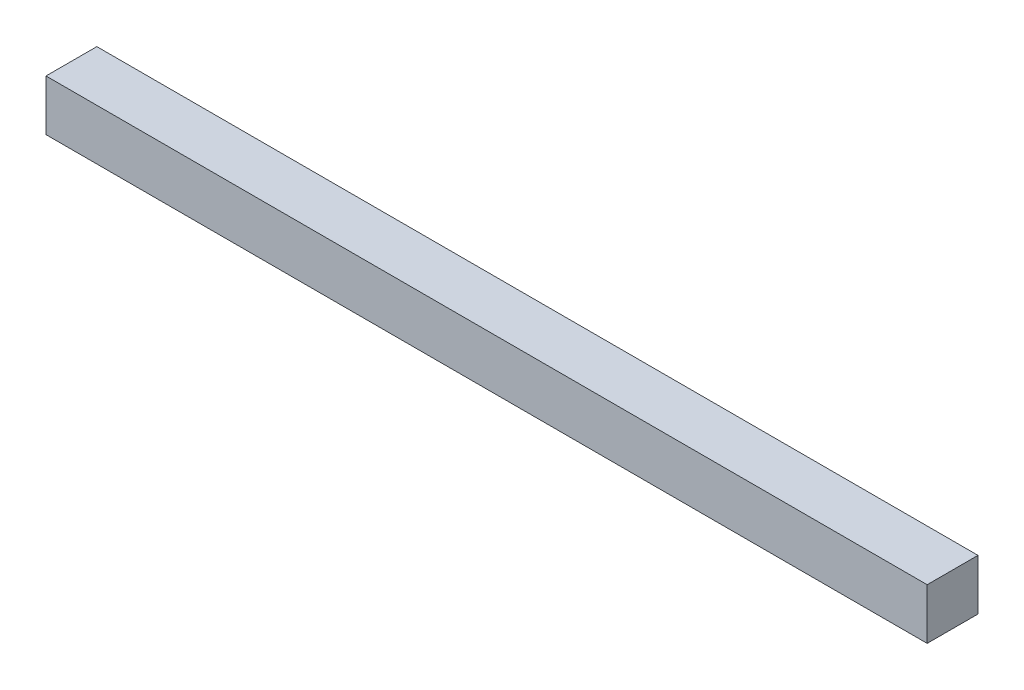
ISO-10303-21;
HEADER;
FILE_DESCRIPTION(('STEP AP214'),'2;1');
FILE_NAME('part.step','',(''),(''),'','','');
FILE_SCHEMA(('AUTOMOTIVE_DESIGN { 1 0 10303 214 1 1 1 1 }'));
ENDSEC;
DATA;
#1=APPLICATION_CONTEXT('core data for automotive mechanical design processes');
#2=APPLICATION_PROTOCOL_DEFINITION('international standard','automotive_design',2000,#1);
#3=PRODUCT_CONTEXT('',#1,'mechanical');
#4=PRODUCT('Part','Part','',(#3));
#5=PRODUCT_RELATED_PRODUCT_CATEGORY('part','',(#4));
#6=PRODUCT_DEFINITION_FORMATION('','',#4);
#7=PRODUCT_DEFINITION_CONTEXT('part definition',#1,'design');
#8=PRODUCT_DEFINITION('design','',#6,#7);
#9=PRODUCT_DEFINITION_SHAPE('','',#8);
#10=(LENGTH_UNIT() NAMED_UNIT(*) SI_UNIT(.MILLI.,.METRE.));
#11=(NAMED_UNIT(*) PLANE_ANGLE_UNIT() SI_UNIT($,.RADIAN.));
#12=(NAMED_UNIT(*) SI_UNIT($,.STERADIAN.) SOLID_ANGLE_UNIT());
#13=UNCERTAINTY_MEASURE_WITH_UNIT(LENGTH_MEASURE(1.E-05),#10,'distance_accuracy_value','');
#14=(GEOMETRIC_REPRESENTATION_CONTEXT(3) GLOBAL_UNCERTAINTY_ASSIGNED_CONTEXT((#13)) GLOBAL_UNIT_ASSIGNED_CONTEXT((#10,
#11,#12)) REPRESENTATION_CONTEXT('',''));
#15=CARTESIAN_POINT('',(0.,0.,0.));
#16=DIRECTION('',(0.,0.,1.));
#17=DIRECTION('',(1.,0.,0.));
#18=AXIS2_PLACEMENT_3D('',#15,#16,#17);
#19=CARTESIAN_POINT('',(-0.0717272727272727,0.00654545454545454,-15.));
#20=DIRECTION('',(0.,-1.,0.));
#21=DIRECTION('',(0.,0.,-1.));
#22=AXIS2_PLACEMENT_3D('',#19,#20,#21);
#23=PLANE('',#22);
#24=DIRECTION('',(1.,0.,0.));
#25=VECTOR('',#24,1.);
#26=CARTESIAN_POINT('',(-0.0717272727272727,0.00654545454545454,0.));
#27=LINE('',#26,#25);
#28=CARTESIAN_POINT('',(-0.0717272727272727,0.00654545454545454,0.));
#29=VERTEX_POINT('',#28);
#30=CARTESIAN_POINT('',(259.928272727273,0.00654545454545454,0.));
#31=VERTEX_POINT('',#30);
#32=EDGE_CURVE('E109',#29,#31,#27,.T.);
#33=ORIENTED_EDGE('',*,*,#32,.F.);
#34=DIRECTION('',(0.,0.,1.));
#35=VECTOR('',#34,1.);
#36=CARTESIAN_POINT('',(-0.0717272727272727,0.00654545454545454,-15.));
#37=LINE('',#36,#35);
#38=CARTESIAN_POINT('',(-0.0717272727272727,0.00654545454545454,-15.));
#39=VERTEX_POINT('',#38);
#40=EDGE_CURVE('E11',#39,#29,#37,.T.);
#41=ORIENTED_EDGE('',*,*,#40,.F.);
#42=DIRECTION('',(1.,0.,0.));
#43=VECTOR('',#42,1.);
#44=CARTESIAN_POINT('',(-0.0717272727272727,0.00654545454545454,-15.));
#45=LINE('',#44,#43);
#46=CARTESIAN_POINT('',(259.928272727273,0.00654545454545454,-15.));
#47=VERTEX_POINT('',#46);
#48=EDGE_CURVE('E101',#39,#47,#45,.T.);
#49=ORIENTED_EDGE('',*,*,#48,.T.);
#50=DIRECTION('',(0.,0.,1.));
#51=VECTOR('',#50,1.);
#52=CARTESIAN_POINT('',(259.928272727273,0.00654545454545454,-15.));
#53=LINE('',#52,#51);
#54=EDGE_CURVE('E42',#47,#31,#53,.T.);
#55=ORIENTED_EDGE('',*,*,#54,.T.);
#56=EDGE_LOOP('',(#33,#41,#49,#55));
#57=FACE_BOUND('',#56,.T.);
#58=ADVANCED_FACE('F39',(#57),#23,.T.);
#59=CARTESIAN_POINT('',(-0.0717272727272746,15.0065454545455,-15.));
#60=DIRECTION('',(-1.,0.,0.));
#61=DIRECTION('',(0.,-1.,0.));
#62=AXIS2_PLACEMENT_3D('',#59,#60,#61);
#63=PLANE('',#62);
#64=DIRECTION('',(0.,-1.,0.));
#65=VECTOR('',#64,1.);
#66=CARTESIAN_POINT('',(-0.0717272727272746,15.0065454545455,0.));
#67=LINE('',#66,#65);
#68=CARTESIAN_POINT('',(-0.0717272727272746,15.0065454545455,0.));
#69=VERTEX_POINT('',#68);
#70=EDGE_CURVE('E104',#69,#29,#67,.T.);
#71=ORIENTED_EDGE('',*,*,#70,.F.);
#72=DIRECTION('',(0.,0.,1.));
#73=VECTOR('',#72,1.);
#74=CARTESIAN_POINT('',(-0.0717272727272746,15.0065454545455,-15.));
#75=LINE('',#74,#73);
#76=CARTESIAN_POINT('',(-0.0717272727272746,15.0065454545455,-15.));
#77=VERTEX_POINT('',#76);
#78=EDGE_CURVE('E49',#77,#69,#75,.T.);
#79=ORIENTED_EDGE('',*,*,#78,.F.);
#80=DIRECTION('',(0.,-1.,0.));
#81=VECTOR('',#80,1.);
#82=CARTESIAN_POINT('',(-0.0717272727272746,15.0065454545455,-15.));
#83=LINE('',#82,#81);
#84=EDGE_CURVE('E88',#77,#39,#83,.T.);
#85=ORIENTED_EDGE('',*,*,#84,.T.);
#86=ORIENTED_EDGE('',*,*,#40,.T.);
#87=EDGE_LOOP('',(#71,#79,#85,#86));
#88=FACE_BOUND('',#87,.T.);
#89=ADVANCED_FACE('F125',(#88),#63,.T.);
#90=CARTESIAN_POINT('',(-0.0717272727272746,15.0065454545455,-15.));
#91=DIRECTION('',(0.,-1.,0.));
#92=DIRECTION('',(0.,0.,-1.));
#93=AXIS2_PLACEMENT_3D('',#90,#91,#92);
#94=PLANE('',#93);
#95=DIRECTION('',(1.,0.,0.));
#96=VECTOR('',#95,1.);
#97=CARTESIAN_POINT('',(-0.0717272727272746,15.0065454545455,0.));
#98=LINE('',#97,#96);
#99=CARTESIAN_POINT('',(259.928272727273,15.0065454545455,0.));
#100=VERTEX_POINT('',#99);
#101=EDGE_CURVE('E94',#69,#100,#98,.T.);
#102=ORIENTED_EDGE('',*,*,#101,.T.);
#103=DIRECTION('',(0.,0.,1.));
#104=VECTOR('',#103,1.);
#105=CARTESIAN_POINT('',(259.928272727273,15.0065454545455,-15.));
#106=LINE('',#105,#104);
#107=CARTESIAN_POINT('',(259.928272727273,15.0065454545455,-15.));
#108=VERTEX_POINT('',#107);
#109=EDGE_CURVE('E92',#108,#100,#106,.T.);
#110=ORIENTED_EDGE('',*,*,#109,.F.);
#111=DIRECTION('',(1.,0.,0.));
#112=VECTOR('',#111,1.);
#113=CARTESIAN_POINT('',(-0.0717272727272746,15.0065454545455,-15.));
#114=LINE('',#113,#112);
#115=EDGE_CURVE('E85',#77,#108,#114,.T.);
#116=ORIENTED_EDGE('',*,*,#115,.F.);
#117=ORIENTED_EDGE('',*,*,#78,.T.);
#118=EDGE_LOOP('',(#102,#110,#116,#117));
#119=FACE_BOUND('',#118,.T.);
#120=ADVANCED_FACE('F93',(#119),#94,.F.);
#121=CARTESIAN_POINT('',(259.928272727273,15.0065454545455,-15.));
#122=DIRECTION('',(-1.,0.,0.));
#123=DIRECTION('',(0.,0.,1.));
#124=AXIS2_PLACEMENT_3D('',#121,#122,#123);
#125=PLANE('',#124);
#126=DIRECTION('',(0.,-1.,0.));
#127=VECTOR('',#126,1.);
#128=CARTESIAN_POINT('',(259.928272727273,15.0065454545455,0.));
#129=LINE('',#128,#127);
#130=EDGE_CURVE('E113',#100,#31,#129,.T.);
#131=ORIENTED_EDGE('',*,*,#130,.T.);
#132=ORIENTED_EDGE('',*,*,#54,.F.);
#133=DIRECTION('',(0.,-1.,0.));
#134=VECTOR('',#133,1.);
#135=CARTESIAN_POINT('',(259.928272727273,15.0065454545455,-15.));
#136=LINE('',#135,#134);
#137=EDGE_CURVE('E82',#108,#47,#136,.T.);
#138=ORIENTED_EDGE('',*,*,#137,.F.);
#139=ORIENTED_EDGE('',*,*,#109,.T.);
#140=EDGE_LOOP('',(#131,#132,#138,#139));
#141=FACE_BOUND('',#140,.T.);
#142=ADVANCED_FACE('F99',(#141),#125,.F.);
#143=CARTESIAN_POINT('',(0.,0.,-15.));
#144=DIRECTION('',(0.,0.,-1.));
#145=DIRECTION('',(-1.,0.,0.));
#146=AXIS2_PLACEMENT_3D('',#143,#144,#145);
#147=PLANE('',#146);
#148=ORIENTED_EDGE('',*,*,#48,.F.);
#149=ORIENTED_EDGE('',*,*,#84,.F.);
#150=ORIENTED_EDGE('',*,*,#115,.T.);
#151=ORIENTED_EDGE('',*,*,#137,.T.);
#152=EDGE_LOOP('',(#148,#149,#150,#151));
#153=FACE_BOUND('',#152,.T.);
#154=ADVANCED_FACE('F87',(#153),#147,.T.);
#155=CARTESIAN_POINT('',(0.,0.,0.));
#156=DIRECTION('',(0.,0.,-1.));
#157=DIRECTION('',(-1.,0.,0.));
#158=AXIS2_PLACEMENT_3D('',#155,#156,#157);
#159=PLANE('',#158);
#160=ORIENTED_EDGE('',*,*,#32,.T.);
#161=ORIENTED_EDGE('',*,*,#130,.F.);
#162=ORIENTED_EDGE('',*,*,#101,.F.);
#163=ORIENTED_EDGE('',*,*,#70,.T.);
#164=EDGE_LOOP('',(#160,#161,#162,#163));
#165=FACE_BOUND('',#164,.T.);
#166=ADVANCED_FACE('F124',(#165),#159,.F.);
#167=CLOSED_SHELL('',(#58,#89,#120,#142,#154,#166));
#168=MANIFOLD_SOLID_BREP('B2',#167);
#169=ADVANCED_BREP_SHAPE_REPRESENTATION('',(#18,#168),#14);
#170=SHAPE_DEFINITION_REPRESENTATION(#9,#169);
ENDSEC;
END-ISO-10303-21;
